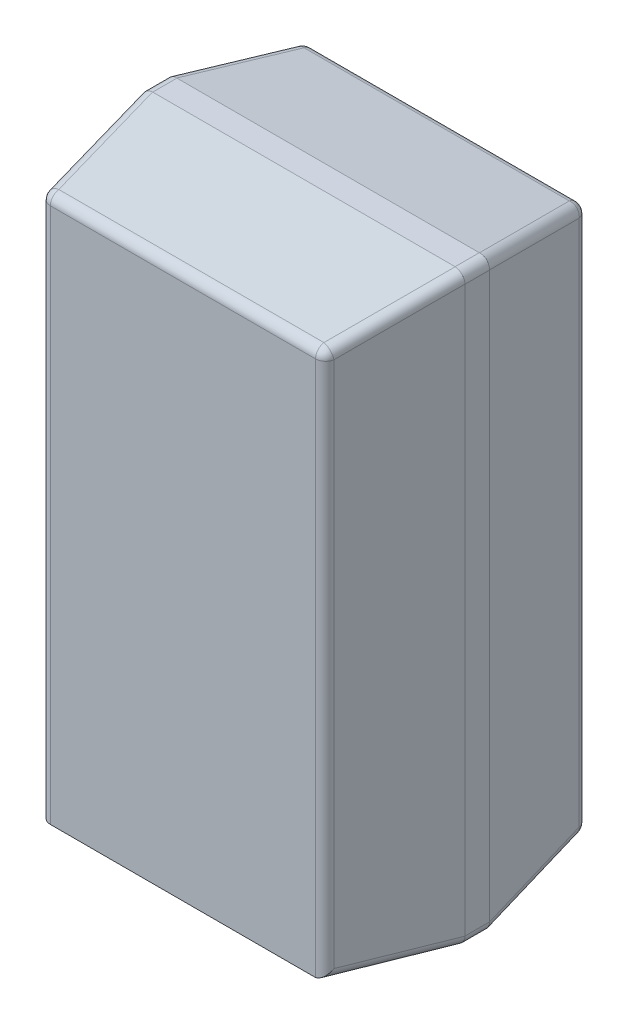
ISO-10303-21;
HEADER;
FILE_DESCRIPTION(('STEP AP214'),'2;1');
FILE_NAME('part.step','',(''),(''),'','','');
FILE_SCHEMA(('AUTOMOTIVE_DESIGN { 1 0 10303 214 1 1 1 1 }'));
ENDSEC;
DATA;
#1=APPLICATION_CONTEXT('core data for automotive mechanical design processes');
#2=APPLICATION_PROTOCOL_DEFINITION('international standard','automotive_design',2000,#1);
#3=PRODUCT_CONTEXT('',#1,'mechanical');
#4=PRODUCT('Part','Part','',(#3));
#5=PRODUCT_RELATED_PRODUCT_CATEGORY('part','',(#4));
#6=PRODUCT_DEFINITION_FORMATION('','',#4);
#7=PRODUCT_DEFINITION_CONTEXT('part definition',#1,'design');
#8=PRODUCT_DEFINITION('design','',#6,#7);
#9=PRODUCT_DEFINITION_SHAPE('','',#8);
#10=(LENGTH_UNIT() NAMED_UNIT(*) SI_UNIT(.MILLI.,.METRE.));
#11=(NAMED_UNIT(*) PLANE_ANGLE_UNIT() SI_UNIT($,.RADIAN.));
#12=(NAMED_UNIT(*) SI_UNIT($,.STERADIAN.) SOLID_ANGLE_UNIT());
#13=UNCERTAINTY_MEASURE_WITH_UNIT(LENGTH_MEASURE(1.E-05),#10,'distance_accuracy_value','');
#14=(GEOMETRIC_REPRESENTATION_CONTEXT(3) GLOBAL_UNCERTAINTY_ASSIGNED_CONTEXT((#13)) GLOBAL_UNIT_ASSIGNED_CONTEXT((#10,
#11,#12)) REPRESENTATION_CONTEXT('',''));
#15=CARTESIAN_POINT('',(0.,0.,0.));
#16=DIRECTION('',(0.,0.,1.));
#17=DIRECTION('',(1.,0.,0.));
#18=AXIS2_PLACEMENT_3D('',#15,#16,#17);
#19=CARTESIAN_POINT('',(0.,0.,1.3));
#20=DIRECTION('',(0.,0.,1.));
#21=DIRECTION('',(1.,0.,0.));
#22=AXIS2_PLACEMENT_3D('',#19,#20,#21);
#23=PLANE('',#22);
#24=DIRECTION('',(0.,1.,0.));
#25=VECTOR('',#24,1.);
#26=CARTESIAN_POINT('',(-0.657643645581,0.3625,1.3));
#27=LINE('',#26,#25);
#28=CARTESIAN_POINT('',(-0.657643645581,-1.35,1.3));
#29=VERTEX_POINT('',#28);
#30=CARTESIAN_POINT('',(-0.657643645581,1.307643645581,1.3));
#31=VERTEX_POINT('',#30);
#32=EDGE_CURVE('E438',#29,#31,#27,.T.);
#33=ORIENTED_EDGE('',*,*,#32,.F.);
#34=DIRECTION('',(-1.,0.,0.));
#35=VECTOR('',#34,1.);
#36=CARTESIAN_POINT('',(-0.4,-1.35,1.3));
#37=LINE('',#36,#35);
#38=CARTESIAN_POINT('',(0.650680303808,-1.35,1.3));
#39=VERTEX_POINT('',#38);
#40=EDGE_CURVE('E412',#39,#29,#37,.T.);
#41=ORIENTED_EDGE('',*,*,#40,.F.);
#42=CARTESIAN_POINT('',(0.649310312248,-1.299310312248,1.3));
#43=DIRECTION('',(0.,0.,-1.));
#44=DIRECTION('',(0.707106781186548,-0.707106781186548,0.));
#45=AXIS2_PLACEMENT_3D('',#42,#43,#44);
#46=ELLIPSE('',#45,0.05137011669141,0.05);
#47=CARTESIAN_POINT('',(0.657643645581,-1.349517272632,1.3));
#48=VERTEX_POINT('',#47);
#49=EDGE_CURVE('E305',#48,#39,#46,.T.);
#50=ORIENTED_EDGE('',*,*,#49,.F.);
#51=DIRECTION('',(0.,-1.,0.));
#52=VECTOR('',#51,1.);
#53=CARTESIAN_POINT('',(0.657643645581,-0.3625,1.3));
#54=LINE('',#53,#52);
#55=CARTESIAN_POINT('',(0.657643645581,1.307643645581,1.3));
#56=VERTEX_POINT('',#55);
#57=EDGE_CURVE('E398',#56,#48,#54,.T.);
#58=ORIENTED_EDGE('',*,*,#57,.F.);
#59=DIRECTION('',(1.,0.,0.));
#60=VECTOR('',#59,1.);
#61=CARTESIAN_POINT('',(0.2,1.307643645581,1.3));
#62=LINE('',#61,#60);
#63=EDGE_CURVE('E391',#31,#56,#62,.T.);
#64=ORIENTED_EDGE('',*,*,#63,.F.);
#65=EDGE_LOOP('',(#33,#41,#50,#58,#64));
#66=FACE_BOUND('',#65,.T.);
#67=ADVANCED_FACE('F17',(#66),#23,.T.);
#68=CARTESIAN_POINT('',(0.75,-0.725,1.));
#69=DIRECTION('',(0.986393923832198,0.,0.164398987305033));
#70=DIRECTION('',(0.,-1.,0.));
#71=AXIS2_PLACEMENT_3D('',#68,#69,#70);
#72=PLANE('',#71);
#73=CARTESIAN_POINT('',(0.75,-1.4,1.));
#74=DIRECTION('',(-0.986393923832198,0.,-0.164398987305033));
#75=DIRECTION('',(0.164398987305033,0.,-0.986393923832198));
#76=AXIS2_PLACEMENT_3D('',#73,#74,#75);
#77=ELLIPSE('',#76,0.304138126515,0.05);
#78=CARTESIAN_POINT('',(0.8,-1.4,0.7));
#79=VERTEX_POINT('',#78);
#80=CARTESIAN_POINT('',(0.799995433581,-1.40067573739,0.700027398512));
#81=VERTEX_POINT('',#80);
#82=EDGE_CURVE('E543',#79,#81,#77,.T.);
#83=ORIENTED_EDGE('',*,*,#82,.F.);
#84=DIRECTION('',(0.,1.,0.));
#85=VECTOR('',#84,1.);
#86=CARTESIAN_POINT('',(0.8,-0.725,0.7));
#87=LINE('',#86,#85);
#88=CARTESIAN_POINT('',(0.8,1.4,0.7));
#89=VERTEX_POINT('',#88);
#90=EDGE_CURVE('E424',#79,#89,#87,.T.);
#91=ORIENTED_EDGE('',*,*,#90,.T.);
#92=CARTESIAN_POINT('',(0.75,1.4,1.));
#93=DIRECTION('',(-0.986393923832198,0.,-0.164398987305033));
#94=DIRECTION('',(0.164398987305033,0.,-0.986393923832198));
#95=AXIS2_PLACEMENT_3D('',#92,#93,#94);
#96=ELLIPSE('',#95,0.304138126515,0.05);
#97=CARTESIAN_POINT('',(0.799995433581,1.40067573739,0.700027398512));
#98=VERTEX_POINT('',#97);
#99=EDGE_CURVE('E375',#98,#89,#96,.T.);
#100=ORIENTED_EDGE('',*,*,#99,.F.);
#101=DIRECTION('',(0.162221421130921,0.162221421130921,-0.973328526784523));
#102=VECTOR('',#101,1.);
#103=CARTESIAN_POINT('',(0.718732097268,1.319412401077,1.187607416391));
#104=LINE('',#103,#102);
#105=CARTESIAN_POINT('',(0.706963341772,1.307643645581,1.258219949365));
#106=VERTEX_POINT('',#105);
#107=EDGE_CURVE('E344',#106,#98,#104,.T.);
#108=ORIENTED_EDGE('',*,*,#107,.F.);
#109=DIRECTION('',(0.,1.,0.));
#110=VECTOR('',#109,1.);
#111=CARTESIAN_POINT('',(0.706963341772,-0.3625,1.258219949365));
#112=LINE('',#111,#110);
#113=CARTESIAN_POINT('',(0.706963341772,-1.307643645581,1.258219949365));
#114=VERTEX_POINT('',#113);
#115=EDGE_CURVE('E395',#114,#106,#112,.T.);
#116=ORIENTED_EDGE('',*,*,#115,.F.);
#117=DIRECTION('',(-0.162221421130921,0.162221421130921,0.973328526784523));
#118=VECTOR('',#117,1.);
#119=CARTESIAN_POINT('',(0.727284728847,-1.327965032656,1.136291626917));
#120=LINE('',#119,#118);
#121=EDGE_CURVE('E470',#81,#114,#120,.T.);
#122=ORIENTED_EDGE('',*,*,#121,.F.);
#123=EDGE_LOOP('',(#83,#91,#100,#108,#116,#122));
#124=FACE_BOUND('',#123,.T.);
#125=ADVANCED_FACE('F618',(#124),#72,.T.);
#126=CARTESIAN_POINT('',(0.8,1.45,0.));
#127=DIRECTION('',(0.,1.,0.));
#128=DIRECTION('',(1.,0.,0.));
#129=AXIS2_PLACEMENT_3D('',#126,#127,#128);
#130=PLANE('',#129);
#131=DIRECTION('',(0.,0.,-1.));
#132=VECTOR('',#131,1.);
#133=CARTESIAN_POINT('',(-0.75,1.45,0.));
#134=LINE('',#133,#132);
#135=CARTESIAN_POINT('',(-0.75,1.45,0.7));
#136=VERTEX_POINT('',#135);
#137=CARTESIAN_POINT('',(-0.75,1.45,0.58));
#138=VERTEX_POINT('',#137);
#139=EDGE_CURVE('E482',#136,#138,#134,.T.);
#140=ORIENTED_EDGE('',*,*,#139,.F.);
#141=DIRECTION('',(-1.,0.,0.));
#142=VECTOR('',#141,1.);
#143=CARTESIAN_POINT('',(0.4,1.45,0.7));
#144=LINE('',#143,#142);
#145=CARTESIAN_POINT('',(0.75,1.45,0.7));
#146=VERTEX_POINT('',#145);
#147=EDGE_CURVE('E20',#146,#136,#144,.T.);
#148=ORIENTED_EDGE('',*,*,#147,.F.);
#149=DIRECTION('',(0.,0.,1.));
#150=VECTOR('',#149,1.);
#151=CARTESIAN_POINT('',(0.75,1.45,0.));
#152=LINE('',#151,#150);
#153=CARTESIAN_POINT('',(0.75,1.45,0.58));
#154=VERTEX_POINT('',#153);
#155=EDGE_CURVE('E365',#154,#146,#152,.T.);
#156=ORIENTED_EDGE('',*,*,#155,.F.);
#157=DIRECTION('',(1.,0.,0.));
#158=VECTOR('',#157,1.);
#159=CARTESIAN_POINT('',(0.4,1.45,0.58));
#160=LINE('',#159,#158);
#161=EDGE_CURVE('E11',#138,#154,#160,.T.);
#162=ORIENTED_EDGE('',*,*,#161,.F.);
#163=EDGE_LOOP('',(#140,#148,#156,#162));
#164=FACE_BOUND('',#163,.T.);
#165=ADVANCED_FACE('F622',(#164),#130,.T.);
#166=CARTESIAN_POINT('',(0.4,1.4,0.29));
#167=DIRECTION('',(0.,0.985460115744279,-0.169906916508048));
#168=DIRECTION('',(-1.,0.,0.));
#169=AXIS2_PLACEMENT_3D('',#166,#167,#168);
#170=PLANE('',#169);
#171=CARTESIAN_POINT('',(-0.75,1.4,0.29));
#172=DIRECTION('',(0.,-0.985460115744279,0.169906916508048));
#173=DIRECTION('',(0.,0.169906916508048,0.985460115744279));
#174=AXIS2_PLACEMENT_3D('',#171,#172,#173);
#175=ELLIPSE('',#174,0.294278779391,0.05);
#176=CARTESIAN_POINT('',(-0.750721784217,1.449994790004,0.579969782023));
#177=VERTEX_POINT('',#176);
#178=EDGE_CURVE('E477',#138,#177,#175,.T.);
#179=ORIENTED_EDGE('',*,*,#178,.F.);
#180=ORIENTED_EDGE('',*,*,#161,.T.);
#181=CARTESIAN_POINT('',(0.75,1.4,0.29));
#182=DIRECTION('',(0.,-0.985460115744279,0.169906916508048));
#183=DIRECTION('',(0.,0.169906916508048,0.985460115744279));
#184=AXIS2_PLACEMENT_3D('',#181,#182,#183);
#185=ELLIPSE('',#184,0.294278779391,0.05);
#186=CARTESIAN_POINT('',(0.750721784217,1.449994790004,0.579969782023));
#187=VERTEX_POINT('',#186);
#188=EDGE_CURVE('E366',#187,#154,#185,.T.);
#189=ORIENTED_EDGE('',*,*,#188,.F.);
#190=DIRECTION('',(0.167506302542942,0.167506302542942,0.971536554750661));
#191=VECTOR('',#190,1.);
#192=CARTESIAN_POINT('',(0.667387291794,1.366660297581,0.09662972596986));
#193=LINE('',#192,#191);
#194=CARTESIAN_POINT('',(0.65788296907,1.357155974858,0.04150465417462));
#195=VERTEX_POINT('',#194);
#196=EDGE_CURVE('E38',#195,#187,#193,.T.);
#197=ORIENTED_EDGE('',*,*,#196,.F.);
#198=DIRECTION('',(1.,0.,0.));
#199=VECTOR('',#198,1.);
#200=CARTESIAN_POINT('',(0.2,1.357155974858,0.04150465417462));
#201=LINE('',#200,#199);
#202=CARTESIAN_POINT('',(-0.65788296907,1.357155974858,0.04150465417462));
#203=VERTEX_POINT('',#202);
#204=EDGE_CURVE('E353',#203,#195,#201,.T.);
#205=ORIENTED_EDGE('',*,*,#204,.F.);
#206=DIRECTION('',(0.167506302542942,-0.167506302542942,-0.971536554750661));
#207=VECTOR('',#206,1.);
#208=CARTESIAN_POINT('',(-0.676506259246,1.375779265033,0.149519737193));
#209=LINE('',#208,#207);
#210=EDGE_CURVE('E331',#177,#203,#209,.T.);
#211=ORIENTED_EDGE('',*,*,#210,.F.);
#212=EDGE_LOOP('',(#179,#180,#189,#197,#205,#211));
#213=FACE_BOUND('',#212,.T.);
#214=ADVANCED_FACE('F626',(#213),#170,.T.);
#215=CARTESIAN_POINT('',(-0.75,0.725,0.29));
#216=DIRECTION('',(-0.985460115744279,0.,-0.169906916508048));
#217=DIRECTION('',(-0.169906916508048,0.,0.985460115744279));
#218=AXIS2_PLACEMENT_3D('',#215,#216,#217);
#219=PLANE('',#218);
#220=CARTESIAN_POINT('',(-0.75,-1.4,0.29));
#221=DIRECTION('',(0.985460115744279,0.,0.169906916508048));
#222=DIRECTION('',(-0.169906916508048,0.,0.985460115744279));
#223=AXIS2_PLACEMENT_3D('',#220,#221,#222);
#224=ELLIPSE('',#223,0.294278779391,0.05);
#225=CARTESIAN_POINT('',(-0.8,-1.4,0.58));
#226=VERTEX_POINT('',#225);
#227=CARTESIAN_POINT('',(-0.799994790004,-1.400721784217,0.579969782023));
#228=VERTEX_POINT('',#227);
#229=EDGE_CURVE('E1134',#226,#228,#224,.T.);
#230=ORIENTED_EDGE('',*,*,#229,.F.);
#231=DIRECTION('',(0.,1.,0.));
#232=VECTOR('',#231,1.);
#233=CARTESIAN_POINT('',(-0.8,0.725,0.58));
#234=LINE('',#233,#232);
#235=CARTESIAN_POINT('',(-0.8,1.4,0.58));
#236=VERTEX_POINT('',#235);
#237=EDGE_CURVE('E408',#226,#236,#234,.T.);
#238=ORIENTED_EDGE('',*,*,#237,.T.);
#239=CARTESIAN_POINT('',(-0.75,1.4,0.29));
#240=DIRECTION('',(0.985460115744279,0.,0.169906916508048));
#241=DIRECTION('',(-0.169906916508048,0.,0.985460115744279));
#242=AXIS2_PLACEMENT_3D('',#239,#240,#241);
#243=ELLIPSE('',#242,0.294278779391,0.05);
#244=CARTESIAN_POINT('',(-0.799994790004,1.400721784217,0.579969782023));
#245=VERTEX_POINT('',#244);
#246=EDGE_CURVE('E489',#245,#236,#243,.T.);
#247=ORIENTED_EDGE('',*,*,#246,.F.);
#248=DIRECTION('',(-0.167506302542942,0.167506302542942,0.971536554750661));
#249=VECTOR('',#248,1.);
#250=CARTESIAN_POINT('',(-0.725779265033,1.326506259246,0.149519737193));
#251=LINE('',#250,#249);
#252=CARTESIAN_POINT('',(-0.707155974858,1.30788296907,0.04150465417462));
#253=VERTEX_POINT('',#252);
#254=EDGE_CURVE('E332',#253,#245,#251,.T.);
#255=ORIENTED_EDGE('',*,*,#254,.F.);
#256=DIRECTION('',(0.,1.,0.));
#257=VECTOR('',#256,1.);
#258=CARTESIAN_POINT('',(-0.707155974858,0.3625,0.04150465417462));
#259=LINE('',#258,#257);
#260=CARTESIAN_POINT('',(-0.707155974858,-1.30788296907,0.04150465417462));
#261=VERTEX_POINT('',#260);
#262=EDGE_CURVE('E401',#261,#253,#259,.T.);
#263=ORIENTED_EDGE('',*,*,#262,.F.);
#264=DIRECTION('',(0.167506302542942,0.167506302542942,-0.971536554750661));
#265=VECTOR('',#264,1.);
#266=CARTESIAN_POINT('',(-0.716660297581,-1.317387291794,0.09662972596986));
#267=LINE('',#266,#265);
#268=EDGE_CURVE('E436',#228,#261,#267,.T.);
#269=ORIENTED_EDGE('',*,*,#268,.F.);
#270=EDGE_LOOP('',(#230,#238,#247,#255,#263,#269));
#271=FACE_BOUND('',#270,.T.);
#272=ADVANCED_FACE('F632',(#271),#219,.T.);
#273=CARTESIAN_POINT('',(0.,0.,0.));
#274=DIRECTION('',(0.,0.,1.));
#275=DIRECTION('',(1.,0.,0.));
#276=AXIS2_PLACEMENT_3D('',#273,#274,#275);
#277=PLANE('',#276);
#278=DIRECTION('',(-1.,0.,0.));
#279=VECTOR('',#278,1.);
#280=CARTESIAN_POINT('',(0.2,1.30788296907,0.));
#281=LINE('',#280,#279);
#282=CARTESIAN_POINT('',(0.65788296907,1.30788296907,0.));
#283=VERTEX_POINT('',#282);
#284=CARTESIAN_POINT('',(-0.65788296907,1.30788296907,0.));
#285=VERTEX_POINT('',#284);
#286=EDGE_CURVE('E263',#283,#285,#281,.T.);
#287=ORIENTED_EDGE('',*,*,#286,.F.);
#288=DIRECTION('',(0.,1.,0.));
#289=VECTOR('',#288,1.);
#290=CARTESIAN_POINT('',(0.65788296907,-0.3625,0.));
#291=LINE('',#290,#289);
#292=CARTESIAN_POINT('',(0.65788296907,-1.30788296907,0.));
#293=VERTEX_POINT('',#292);
#294=EDGE_CURVE('E257',#293,#283,#291,.T.);
#295=ORIENTED_EDGE('',*,*,#294,.F.);
#296=DIRECTION('',(1.,0.,0.));
#297=VECTOR('',#296,1.);
#298=CARTESIAN_POINT('',(-0.2,-1.30788296907,0.));
#299=LINE('',#298,#297);
#300=CARTESIAN_POINT('',(-0.65788296907,-1.30788296907,0.));
#301=VERTEX_POINT('',#300);
#302=EDGE_CURVE('E260',#301,#293,#299,.T.);
#303=ORIENTED_EDGE('',*,*,#302,.F.);
#304=DIRECTION('',(0.,-1.,0.));
#305=VECTOR('',#304,1.);
#306=CARTESIAN_POINT('',(-0.65788296907,0.3625,0.));
#307=LINE('',#306,#305);
#308=EDGE_CURVE('E404',#285,#301,#307,.T.);
#309=ORIENTED_EDGE('',*,*,#308,.F.);
#310=EDGE_LOOP('',(#287,#295,#303,#309));
#311=FACE_BOUND('',#310,.T.);
#312=ADVANCED_FACE('F259',(#311),#277,.F.);
#313=CARTESIAN_POINT('',(0.4,1.4,1.));
#314=DIRECTION('',(0.,0.986393923832198,0.164398987305033));
#315=DIRECTION('',(1.,0.,0.));
#316=AXIS2_PLACEMENT_3D('',#313,#314,#315);
#317=PLANE('',#316);
#318=CARTESIAN_POINT('',(-0.75,1.4,1.));
#319=DIRECTION('',(0.,-0.986393923832198,-0.164398987305033));
#320=DIRECTION('',(0.,0.164398987305033,-0.986393923832198));
#321=AXIS2_PLACEMENT_3D('',#318,#319,#320);
#322=ELLIPSE('',#321,0.304138126515,0.05);
#323=CARTESIAN_POINT('',(-0.75067573739,1.449995433581,0.700027398512));
#324=VERTEX_POINT('',#323);
#325=EDGE_CURVE('E474',#324,#136,#322,.T.);
#326=ORIENTED_EDGE('',*,*,#325,.F.);
#327=DIRECTION('',(-0.162221421130921,0.162221421130921,-0.973328526784523));
#328=VECTOR('',#327,1.);
#329=CARTESIAN_POINT('',(-0.677965032656,1.377284728847,1.136291626917));
#330=LINE('',#329,#328);
#331=CARTESIAN_POINT('',(-0.657643645581,1.356963341772,1.258219949365));
#332=VERTEX_POINT('',#331);
#333=EDGE_CURVE('E448',#332,#324,#330,.T.);
#334=ORIENTED_EDGE('',*,*,#333,.F.);
#335=DIRECTION('',(-1.,0.,0.));
#336=VECTOR('',#335,1.);
#337=CARTESIAN_POINT('',(0.2,1.356963341772,1.258219949365));
#338=LINE('',#337,#336);
#339=CARTESIAN_POINT('',(0.657643645581,1.356963341772,1.258219949365));
#340=VERTEX_POINT('',#339);
#341=EDGE_CURVE('E269',#340,#332,#338,.T.);
#342=ORIENTED_EDGE('',*,*,#341,.F.);
#343=DIRECTION('',(-0.162221421130921,-0.162221421130921,0.973328526784523));
#344=VECTOR('',#343,1.);
#345=CARTESIAN_POINT('',(0.669412401077,1.368732097268,1.187607416391));
#346=LINE('',#345,#344);
#347=CARTESIAN_POINT('',(0.75067573739,1.449995433581,0.700027398512));
#348=VERTEX_POINT('',#347);
#349=EDGE_CURVE('E349',#348,#340,#346,.T.);
#350=ORIENTED_EDGE('',*,*,#349,.F.);
#351=CARTESIAN_POINT('',(0.75,1.4,1.));
#352=DIRECTION('',(0.,-0.986393923832198,-0.164398987305033));
#353=DIRECTION('',(0.,0.164398987305033,-0.986393923832198));
#354=AXIS2_PLACEMENT_3D('',#351,#352,#353);
#355=ELLIPSE('',#354,0.304138126515,0.05);
#356=EDGE_CURVE('E374',#146,#348,#355,.T.);
#357=ORIENTED_EDGE('',*,*,#356,.F.);
#358=ORIENTED_EDGE('',*,*,#147,.T.);
#359=EDGE_LOOP('',(#326,#334,#342,#350,#357,#358));
#360=FACE_BOUND('',#359,.T.);
#361=ADVANCED_FACE('F638',(#360),#317,.T.);
#362=CARTESIAN_POINT('',(0.8,-1.45,0.));
#363=DIRECTION('',(1.,0.,0.));
#364=DIRECTION('',(0.,1.,0.));
#365=AXIS2_PLACEMENT_3D('',#362,#363,#364);
#366=PLANE('',#365);
#367=DIRECTION('',(0.,0.,1.));
#368=VECTOR('',#367,1.);
#369=CARTESIAN_POINT('',(0.8,-1.4,0.));
#370=LINE('',#369,#368);
#371=CARTESIAN_POINT('',(0.8,-1.4,0.58));
#372=VERTEX_POINT('',#371);
#373=EDGE_CURVE('E550',#372,#79,#370,.T.);
#374=ORIENTED_EDGE('',*,*,#373,.F.);
#375=DIRECTION('',(0.,-1.,0.));
#376=VECTOR('',#375,1.);
#377=CARTESIAN_POINT('',(0.8,-0.725,0.58));
#378=LINE('',#377,#376);
#379=CARTESIAN_POINT('',(0.8,1.4,0.58));
#380=VERTEX_POINT('',#379);
#381=EDGE_CURVE('E414',#380,#372,#378,.T.);
#382=ORIENTED_EDGE('',*,*,#381,.F.);
#383=DIRECTION('',(0.,0.,-1.));
#384=VECTOR('',#383,1.);
#385=CARTESIAN_POINT('',(0.8,1.4,0.));
#386=LINE('',#385,#384);
#387=EDGE_CURVE('E379',#89,#380,#386,.T.);
#388=ORIENTED_EDGE('',*,*,#387,.F.);
#389=ORIENTED_EDGE('',*,*,#90,.F.);
#390=EDGE_LOOP('',(#374,#382,#388,#389));
#391=FACE_BOUND('',#390,.T.);
#392=ADVANCED_FACE('F641',(#391),#366,.T.);
#393=CARTESIAN_POINT('',(0.75,-0.725,0.29));
#394=DIRECTION('',(0.985460115744279,0.,-0.169906916508048));
#395=DIRECTION('',(0.,-1.,0.));
#396=AXIS2_PLACEMENT_3D('',#393,#394,#395);
#397=PLANE('',#396);
#398=CARTESIAN_POINT('',(0.75,-1.4,0.29));
#399=DIRECTION('',(-0.985460115744279,0.,0.169906916508048));
#400=DIRECTION('',(0.169906916508048,0.,0.985460115744279));
#401=AXIS2_PLACEMENT_3D('',#398,#399,#400);
#402=ELLIPSE('',#401,0.294278779391,0.05);
#403=CARTESIAN_POINT('',(0.799994790004,-1.400721784217,0.579969782023));
#404=VERTEX_POINT('',#403);
#405=EDGE_CURVE('E572',#404,#372,#402,.T.);
#406=ORIENTED_EDGE('',*,*,#405,.F.);
#407=DIRECTION('',(0.167506302542942,-0.167506302542942,0.971536554750661));
#408=VECTOR('',#407,1.);
#409=CARTESIAN_POINT('',(0.725779265033,-1.326506259246,0.149519737193));
#410=LINE('',#409,#408);
#411=CARTESIAN_POINT('',(0.707155974858,-1.30788296907,0.04150465417462));
#412=VERTEX_POINT('',#411);
#413=EDGE_CURVE('E312',#412,#404,#410,.T.);
#414=ORIENTED_EDGE('',*,*,#413,.F.);
#415=DIRECTION('',(0.,-1.,0.));
#416=VECTOR('',#415,1.);
#417=CARTESIAN_POINT('',(0.707155974858,-0.3625,0.04150465417462));
#418=LINE('',#417,#416);
#419=CARTESIAN_POINT('',(0.707155974858,1.30788296907,0.04150465417462));
#420=VERTEX_POINT('',#419);
#421=EDGE_CURVE('E270',#420,#412,#418,.T.);
#422=ORIENTED_EDGE('',*,*,#421,.F.);
#423=DIRECTION('',(-0.167506302542942,-0.167506302542942,-0.971536554750661));
#424=VECTOR('',#423,1.);
#425=CARTESIAN_POINT('',(0.716660297581,1.317387291794,0.09662972596986));
#426=LINE('',#425,#424);
#427=CARTESIAN_POINT('',(0.799994790004,1.400721784217,0.579969782023));
#428=VERTEX_POINT('',#427);
#429=EDGE_CURVE('E48',#428,#420,#426,.T.);
#430=ORIENTED_EDGE('',*,*,#429,.F.);
#431=CARTESIAN_POINT('',(0.75,1.4,0.29));
#432=DIRECTION('',(-0.985460115744279,0.,0.169906916508048));
#433=DIRECTION('',(0.169906916508048,0.,0.985460115744279));
#434=AXIS2_PLACEMENT_3D('',#431,#432,#433);
#435=ELLIPSE('',#434,0.294278779391,0.05);
#436=EDGE_CURVE('E380',#380,#428,#435,.T.);
#437=ORIENTED_EDGE('',*,*,#436,.F.);
#438=ORIENTED_EDGE('',*,*,#381,.T.);
#439=EDGE_LOOP('',(#406,#414,#422,#430,#437,#438));
#440=FACE_BOUND('',#439,.T.);
#441=ADVANCED_FACE('F645',(#440),#397,.T.);
#442=CARTESIAN_POINT('',(-0.4,-1.4,1.));
#443=DIRECTION('',(0.,-0.986393923832198,0.164398987305033));
#444=DIRECTION('',(-1.,0.,0.));
#445=AXIS2_PLACEMENT_3D('',#442,#443,#444);
#446=PLANE('',#445);
#447=CARTESIAN_POINT('',(-0.75,-1.4,1.));
#448=DIRECTION('',(0.,0.986393923832198,-0.164398987305033));
#449=DIRECTION('',(0.,-0.164398987305033,-0.986393923832198));
#450=AXIS2_PLACEMENT_3D('',#447,#448,#449);
#451=ELLIPSE('',#450,0.304138126515,0.05);
#452=CARTESIAN_POINT('',(-0.75,-1.45,0.7));
#453=VERTEX_POINT('',#452);
#454=CARTESIAN_POINT('',(-0.785355339059,-1.435355339059,0.787867965644));
#455=VERTEX_POINT('',#454);
#456=EDGE_CURVE('E557',#453,#455,#451,.T.);
#457=ORIENTED_EDGE('',*,*,#456,.F.);
#458=DIRECTION('',(1.,0.,0.));
#459=VECTOR('',#458,1.);
#460=CARTESIAN_POINT('',(-0.4,-1.45,0.7));
#461=LINE('',#460,#459);
#462=CARTESIAN_POINT('',(0.75,-1.45,0.7));
#463=VERTEX_POINT('',#462);
#464=EDGE_CURVE('E415',#453,#463,#461,.T.);
#465=ORIENTED_EDGE('',*,*,#464,.T.);
#466=CARTESIAN_POINT('',(0.75,-1.4,1.));
#467=DIRECTION('',(0.,0.986393923832198,-0.164398987305033));
#468=DIRECTION('',(0.,-0.164398987305033,-0.986393923832198));
#469=AXIS2_PLACEMENT_3D('',#466,#467,#468);
#470=ELLIPSE('',#469,0.304138126515,0.05);
#471=CARTESIAN_POINT('',(0.75067573739,-1.449995433581,0.700027398512));
#472=VERTEX_POINT('',#471);
#473=EDGE_CURVE('E537',#472,#463,#470,.T.);
#474=ORIENTED_EDGE('',*,*,#473,.F.);
#475=DIRECTION('',(0.162221421130921,-0.162221421130921,-0.973328526784523));
#476=VECTOR('',#475,1.);
#477=CARTESIAN_POINT('',(0.677965032656,-1.377284728847,1.136291626917));
#478=LINE('',#477,#476);
#479=EDGE_CURVE('E297',#39,#472,#478,.T.);
#480=ORIENTED_EDGE('',*,*,#479,.F.);
#481=ORIENTED_EDGE('',*,*,#40,.T.);
#482=CARTESIAN_POINT('',(-0.657643645581,-1.358333333333,1.25));
#483=DIRECTION('',(0.,0.986393923832198,-0.164398987305033));
#484=DIRECTION('',(0.,0.164398987305033,0.986393923832198));
#485=AXIS2_PLACEMENT_3D('',#482,#483,#484);
#486=ELLIPSE('',#485,0.05068968775249,0.05);
#487=CARTESIAN_POINT('',(-0.706963341772,-1.356963341772,1.258219949365));
#488=VERTEX_POINT('',#487);
#489=EDGE_CURVE('E443',#488,#29,#486,.T.);
#490=ORIENTED_EDGE('',*,*,#489,.F.);
#491=DIRECTION('',(0.162221421130921,0.162221421130921,0.973328526784523));
#492=VECTOR('',#491,1.);
#493=CARTESIAN_POINT('',(-0.717434210526,-1.367434210526,1.195394736842));
#494=LINE('',#493,#492);
#495=EDGE_CURVE('E410',#455,#488,#494,.T.);
#496=ORIENTED_EDGE('',*,*,#495,.F.);
#497=EDGE_LOOP('',(#457,#465,#474,#480,#481,#490,#496));
#498=FACE_BOUND('',#497,.T.);
#499=ADVANCED_FACE('F535',(#498),#446,.T.);
#500=CARTESIAN_POINT('',(-0.8,-1.45,0.));
#501=DIRECTION('',(0.,-1.,0.));
#502=DIRECTION('',(0.,0.,-1.));
#503=AXIS2_PLACEMENT_3D('',#500,#501,#502);
#504=PLANE('',#503);
#505=DIRECTION('',(0.,0.,1.));
#506=VECTOR('',#505,1.);
#507=CARTESIAN_POINT('',(-0.75,-1.45,0.));
#508=LINE('',#507,#506);
#509=CARTESIAN_POINT('',(-0.75,-1.45,0.58));
#510=VERTEX_POINT('',#509);
#511=EDGE_CURVE('E1101',#510,#453,#508,.T.);
#512=ORIENTED_EDGE('',*,*,#511,.F.);
#513=DIRECTION('',(-1.,0.,0.));
#514=VECTOR('',#513,1.);
#515=CARTESIAN_POINT('',(-0.4,-1.45,0.58));
#516=LINE('',#515,#514);
#517=CARTESIAN_POINT('',(0.75,-1.45,0.58));
#518=VERTEX_POINT('',#517);
#519=EDGE_CURVE('E407',#518,#510,#516,.T.);
#520=ORIENTED_EDGE('',*,*,#519,.F.);
#521=DIRECTION('',(0.,0.,-1.));
#522=VECTOR('',#521,1.);
#523=CARTESIAN_POINT('',(0.75,-1.45,0.));
#524=LINE('',#523,#522);
#525=EDGE_CURVE('E566',#463,#518,#524,.T.);
#526=ORIENTED_EDGE('',*,*,#525,.F.);
#527=ORIENTED_EDGE('',*,*,#464,.F.);
#528=EDGE_LOOP('',(#512,#520,#526,#527));
#529=FACE_BOUND('',#528,.T.);
#530=ADVANCED_FACE('F649',(#529),#504,.T.);
#531=CARTESIAN_POINT('',(-0.75,0.725,1.));
#532=DIRECTION('',(-0.986393923832198,0.,0.164398987305033));
#533=DIRECTION('',(0.,1.,0.));
#534=AXIS2_PLACEMENT_3D('',#531,#532,#533);
#535=PLANE('',#534);
#536=CARTESIAN_POINT('',(-0.75,-1.4,1.));
#537=DIRECTION('',(0.986393923832198,0.,-0.164398987305033));
#538=DIRECTION('',(-0.164398987305033,0.,-0.986393923832198));
#539=AXIS2_PLACEMENT_3D('',#536,#537,#538);
#540=ELLIPSE('',#539,0.304138126515,0.05);
#541=CARTESIAN_POINT('',(-0.8,-1.4,0.7));
#542=VERTEX_POINT('',#541);
#543=EDGE_CURVE('E1135',#455,#542,#540,.T.);
#544=ORIENTED_EDGE('',*,*,#543,.F.);
#545=ORIENTED_EDGE('',*,*,#495,.T.);
#546=DIRECTION('',(0.,-1.,0.));
#547=VECTOR('',#546,1.);
#548=CARTESIAN_POINT('',(-0.706963341772,0.3625,1.258219949365));
#549=LINE('',#548,#547);
#550=CARTESIAN_POINT('',(-0.706963341772,1.307643645581,1.258219949365));
#551=VERTEX_POINT('',#550);
#552=EDGE_CURVE('E442',#551,#488,#549,.T.);
#553=ORIENTED_EDGE('',*,*,#552,.F.);
#554=DIRECTION('',(0.162221421130921,-0.162221421130921,0.973328526784523));
#555=VECTOR('',#554,1.);
#556=CARTESIAN_POINT('',(-0.727284728847,1.327965032656,1.136291626917));
#557=LINE('',#556,#555);
#558=CARTESIAN_POINT('',(-0.799995433581,1.40067573739,0.700027398512));
#559=VERTEX_POINT('',#558);
#560=EDGE_CURVE('E444',#559,#551,#557,.T.);
#561=ORIENTED_EDGE('',*,*,#560,.F.);
#562=CARTESIAN_POINT('',(-0.75,1.4,1.));
#563=DIRECTION('',(0.986393923832198,0.,-0.164398987305033));
#564=DIRECTION('',(-0.164398987305033,0.,-0.986393923832198));
#565=AXIS2_PLACEMENT_3D('',#562,#563,#564);
#566=ELLIPSE('',#565,0.304138126515,0.05);
#567=CARTESIAN_POINT('',(-0.8,1.4,0.7));
#568=VERTEX_POINT('',#567);
#569=EDGE_CURVE('E454',#568,#559,#566,.T.);
#570=ORIENTED_EDGE('',*,*,#569,.F.);
#571=DIRECTION('',(0.,-1.,0.));
#572=VECTOR('',#571,1.);
#573=CARTESIAN_POINT('',(-0.8,0.725,0.7));
#574=LINE('',#573,#572);
#575=EDGE_CURVE('E411',#568,#542,#574,.T.);
#576=ORIENTED_EDGE('',*,*,#575,.T.);
#577=EDGE_LOOP('',(#544,#545,#553,#561,#570,#576));
#578=FACE_BOUND('',#577,.T.);
#579=ADVANCED_FACE('F650',(#578),#535,.T.);
#580=CARTESIAN_POINT('',(-0.8,1.45,0.));
#581=DIRECTION('',(-1.,0.,0.));
#582=DIRECTION('',(0.,1.,0.));
#583=AXIS2_PLACEMENT_3D('',#580,#581,#582);
#584=PLANE('',#583);
#585=DIRECTION('',(0.,0.,-1.));
#586=VECTOR('',#585,1.);
#587=CARTESIAN_POINT('',(-0.8,-1.4,0.));
#588=LINE('',#587,#586);
#589=EDGE_CURVE('E1129',#542,#226,#588,.T.);
#590=ORIENTED_EDGE('',*,*,#589,.F.);
#591=ORIENTED_EDGE('',*,*,#575,.F.);
#592=DIRECTION('',(0.,0.,1.));
#593=VECTOR('',#592,1.);
#594=CARTESIAN_POINT('',(-0.8,1.4,0.));
#595=LINE('',#594,#593);
#596=EDGE_CURVE('E450',#236,#568,#595,.T.);
#597=ORIENTED_EDGE('',*,*,#596,.F.);
#598=ORIENTED_EDGE('',*,*,#237,.F.);
#599=EDGE_LOOP('',(#590,#591,#597,#598));
#600=FACE_BOUND('',#599,.T.);
#601=ADVANCED_FACE('F653',(#600),#584,.T.);
#602=CARTESIAN_POINT('',(-0.4,-1.4,0.29));
#603=DIRECTION('',(0.,-0.985460115744279,-0.169906916508048));
#604=DIRECTION('',(0.,0.169906916508048,-0.985460115744279));
#605=AXIS2_PLACEMENT_3D('',#602,#603,#604);
#606=PLANE('',#605);
#607=CARTESIAN_POINT('',(-0.75,-1.4,0.29));
#608=DIRECTION('',(0.,0.985460115744279,0.169906916508048));
#609=DIRECTION('',(0.,-0.169906916508048,0.985460115744279));
#610=AXIS2_PLACEMENT_3D('',#607,#608,#609);
#611=ELLIPSE('',#610,0.294278779391,0.05);
#612=CARTESIAN_POINT('',(-0.750721784217,-1.449994790004,0.579969782023));
#613=VERTEX_POINT('',#612);
#614=EDGE_CURVE('E1096',#613,#510,#611,.T.);
#615=ORIENTED_EDGE('',*,*,#614,.F.);
#616=DIRECTION('',(-0.167506302542942,-0.167506302542942,0.971536554750661));
#617=VECTOR('',#616,1.);
#618=CARTESIAN_POINT('',(-0.667387291794,-1.366660297581,0.09662972596986));
#619=LINE('',#618,#617);
#620=CARTESIAN_POINT('',(-0.65788296907,-1.357155974858,0.04150465417462));
#621=VERTEX_POINT('',#620);
#622=EDGE_CURVE('E455',#621,#613,#619,.T.);
#623=ORIENTED_EDGE('',*,*,#622,.F.);
#624=DIRECTION('',(-1.,0.,0.));
#625=VECTOR('',#624,1.);
#626=CARTESIAN_POINT('',(-0.2,-1.357155974858,0.04150465417462));
#627=LINE('',#626,#625);
#628=CARTESIAN_POINT('',(0.65788296907,-1.357155974858,0.04150465417462));
#629=VERTEX_POINT('',#628);
#630=EDGE_CURVE('E283',#629,#621,#627,.T.);
#631=ORIENTED_EDGE('',*,*,#630,.F.);
#632=DIRECTION('',(-0.167506302542942,0.167506302542942,-0.971536554750661));
#633=VECTOR('',#632,1.);
#634=CARTESIAN_POINT('',(0.676506259246,-1.375779265033,0.149519737193));
#635=LINE('',#634,#633);
#636=CARTESIAN_POINT('',(0.750721784217,-1.449994790004,0.579969782023));
#637=VERTEX_POINT('',#636);
#638=EDGE_CURVE('E292',#637,#629,#635,.T.);
#639=ORIENTED_EDGE('',*,*,#638,.F.);
#640=CARTESIAN_POINT('',(0.75,-1.4,0.29));
#641=DIRECTION('',(0.,0.985460115744279,0.169906916508048));
#642=DIRECTION('',(0.,-0.169906916508048,0.985460115744279));
#643=AXIS2_PLACEMENT_3D('',#640,#641,#642);
#644=ELLIPSE('',#643,0.294278779391,0.05);
#645=EDGE_CURVE('E567',#518,#637,#644,.T.);
#646=ORIENTED_EDGE('',*,*,#645,.F.);
#647=ORIENTED_EDGE('',*,*,#519,.T.);
#648=EDGE_LOOP('',(#615,#623,#631,#639,#646,#647));
#649=FACE_BOUND('',#648,.T.);
#650=ADVANCED_FACE('F657',(#649),#606,.T.);
#651=CARTESIAN_POINT('',(-0.65788296907,0.3625,0.05));
#652=DIRECTION('',(0.,-1.,0.));
#653=DIRECTION('',(-0.644241058724346,0.,-0.764822501142411));
#654=AXIS2_PLACEMENT_3D('',#651,#652,#653);
#655=CYLINDRICAL_SURFACE('',#654,0.05);
#656=CARTESIAN_POINT('',(-0.65788296907,-1.30788296907,0.05));
#657=DIRECTION('',(0.,-1.,0.));
#658=DIRECTION('',(0.,0.,-1.));
#659=AXIS2_PLACEMENT_3D('',#656,#657,#658);
#660=CIRCLE('',#659,0.05);
#661=EDGE_CURVE('E580',#261,#301,#660,.T.);
#662=ORIENTED_EDGE('',*,*,#661,.F.);
#663=ORIENTED_EDGE('',*,*,#262,.T.);
#664=CARTESIAN_POINT('',(-0.65788296907,1.30788296907,0.05));
#665=DIRECTION('',(0.,1.,0.));
#666=DIRECTION('',(-0.985460115744279,0.,-0.169906916508048));
#667=AXIS2_PLACEMENT_3D('',#664,#665,#666);
#668=CIRCLE('',#667,0.05);
#669=EDGE_CURVE('E282',#285,#253,#668,.T.);
#670=ORIENTED_EDGE('',*,*,#669,.F.);
#671=ORIENTED_EDGE('',*,*,#308,.T.);
#672=EDGE_LOOP('',(#662,#663,#670,#671));
#673=FACE_BOUND('',#672,.T.);
#674=ADVANCED_FACE('F600',(#673),#655,.T.);
#675=CARTESIAN_POINT('',(0.657643645581,-0.3625,1.25));
#676=DIRECTION('',(0.,-1.,0.));
#677=DIRECTION('',(0.646374896129947,0.,0.763019982472937));
#678=AXIS2_PLACEMENT_3D('',#675,#676,#677);
#679=CYLINDRICAL_SURFACE('',#678,0.05);
#680=ORIENTED_EDGE('',*,*,#115,.T.);
#681=CARTESIAN_POINT('',(0.657643645581,1.307643645581,1.25));
#682=DIRECTION('',(0.,1.,0.));
#683=DIRECTION('',(0.986393923832198,0.,0.164398987305033));
#684=AXIS2_PLACEMENT_3D('',#681,#682,#683);
#685=CIRCLE('',#684,0.05);
#686=EDGE_CURVE('E335',#56,#106,#685,.T.);
#687=ORIENTED_EDGE('',*,*,#686,.F.);
#688=ORIENTED_EDGE('',*,*,#57,.T.);
#689=CARTESIAN_POINT('',(0.657643645581,-1.307643645581,1.25));
#690=DIRECTION('',(0.106401748795925,-0.762306179015997,-0.638410492776551));
#691=DIRECTION('',(-0.125322363847009,-0.647216570735044,0.751934183081051));
#692=AXIS2_PLACEMENT_3D('',#689,#690,#691);
#693=ELLIPSE('',#692,0.06559044302194,0.05);
#694=EDGE_CURVE('E462',#114,#48,#693,.T.);
#695=ORIENTED_EDGE('',*,*,#694,.F.);
#696=EDGE_LOOP('',(#680,#687,#688,#695));
#697=FACE_BOUND('',#696,.T.);
#698=ADVANCED_FACE('F531',(#697),#679,.T.);
#699=CARTESIAN_POINT('',(0.2,1.307643645581,1.25));
#700=DIRECTION('',(1.,0.,0.));
#701=DIRECTION('',(0.,0.646374896129947,0.763019982472937));
#702=AXIS2_PLACEMENT_3D('',#699,#700,#701);
#703=CYLINDRICAL_SURFACE('',#702,0.05);
#704=CARTESIAN_POINT('',(0.657643645581,1.307643645581,1.25));
#705=DIRECTION('',(1.,0.,0.));
#706=DIRECTION('',(0.,0.,1.));
#707=AXIS2_PLACEMENT_3D('',#704,#705,#706);
#708=CIRCLE('',#707,0.05);
#709=EDGE_CURVE('E313',#340,#56,#708,.T.);
#710=ORIENTED_EDGE('',*,*,#709,.F.);
#711=ORIENTED_EDGE('',*,*,#341,.T.);
#712=CARTESIAN_POINT('',(-0.657643645581,1.307643645581,1.25));
#713=DIRECTION('',(-1.,0.,0.));
#714=DIRECTION('',(0.,0.986393923832198,0.164398987305033));
#715=AXIS2_PLACEMENT_3D('',#712,#713,#714);
#716=CIRCLE('',#715,0.05);
#717=EDGE_CURVE('E493',#31,#332,#716,.T.);
#718=ORIENTED_EDGE('',*,*,#717,.F.);
#719=ORIENTED_EDGE('',*,*,#63,.T.);
#720=EDGE_LOOP('',(#710,#711,#718,#719));
#721=FACE_BOUND('',#720,.T.);
#722=ADVANCED_FACE('F670',(#721),#703,.T.);
#723=CARTESIAN_POINT('',(0.65788296907,-0.3625,0.05));
#724=DIRECTION('',(0.,1.,0.));
#725=DIRECTION('',(0.644241058724346,0.,-0.764822501142411));
#726=AXIS2_PLACEMENT_3D('',#723,#724,#725);
#727=CYLINDRICAL_SURFACE('',#726,0.05);
#728=CARTESIAN_POINT('',(0.65788296907,1.30788296907,0.05));
#729=DIRECTION('',(0.,1.,0.));
#730=DIRECTION('',(0.,0.,-1.));
#731=AXIS2_PLACEMENT_3D('',#728,#729,#730);
#732=CIRCLE('',#731,0.05);
#733=EDGE_CURVE('E317',#420,#283,#732,.T.);
#734=ORIENTED_EDGE('',*,*,#733,.F.);
#735=ORIENTED_EDGE('',*,*,#421,.T.);
#736=CARTESIAN_POINT('',(0.65788296907,-1.30788296907,0.05));
#737=DIRECTION('',(0.,-1.,0.));
#738=DIRECTION('',(0.985460115744279,0.,-0.169906916508048));
#739=AXIS2_PLACEMENT_3D('',#736,#737,#738);
#740=CIRCLE('',#739,0.05);
#741=EDGE_CURVE('E288',#293,#412,#740,.T.);
#742=ORIENTED_EDGE('',*,*,#741,.F.);
#743=ORIENTED_EDGE('',*,*,#294,.T.);
#744=EDGE_LOOP('',(#734,#735,#742,#743));
#745=FACE_BOUND('',#744,.T.);
#746=ADVANCED_FACE('F294',(#745),#727,.T.);
#747=CARTESIAN_POINT('',(0.667387291794,1.317387291794,0.105125071795));
#748=DIRECTION('',(0.167506302543432,0.167506302543432,0.971536554750492));
#749=DIRECTION('',(0.686980086034689,0.686980086034689,-0.236889684839892));
#750=AXIS2_PLACEMENT_3D('',#747,#748,#749);
#751=CYLINDRICAL_SURFACE('',#750,0.05);
#752=ORIENTED_EDGE('',*,*,#429,.T.);
#753=CARTESIAN_POINT('',(0.65788296907,1.30788296907,0.05));
#754=DIRECTION('',(-0.167506302543606,-0.167506302542942,-0.971536554750547));
#755=DIRECTION('',(0.985460115744279,0.,-0.169906916508048));
#756=AXIS2_PLACEMENT_3D('',#753,#754,#755);
#757=CIRCLE('',#756,0.05);
#758=EDGE_CURVE('E343',#195,#420,#757,.T.);
#759=ORIENTED_EDGE('',*,*,#758,.F.);
#760=ORIENTED_EDGE('',*,*,#196,.T.);
#761=CARTESIAN_POINT('',(0.75,1.4,0.584278779391));
#762=DIRECTION('',(0.0843555647980143,0.0843555647980243,0.992858639170358));
#763=DIRECTION('',(0.702057076517007,0.702057076517007,-0.119296783799001));
#764=AXIS2_PLACEMENT_3D('',#761,#762,#763);
#765=ELLIPSE('',#764,0.05035963633431,0.05);
#766=EDGE_CURVE('E370',#428,#187,#765,.T.);
#767=ORIENTED_EDGE('',*,*,#766,.F.);
#768=EDGE_LOOP('',(#752,#759,#760,#767));
#769=FACE_BOUND('',#768,.T.);
#770=ADVANCED_FACE('F669',(#769),#751,.T.);
#771=CARTESIAN_POINT('',(0.75,1.4,0.));
#772=DIRECTION('',(0.,0.,1.));
#773=DIRECTION('',(0.707106781186548,0.707106781186548,0.));
#774=AXIS2_PLACEMENT_3D('',#771,#772,#773);
#775=CYLINDRICAL_SURFACE('',#774,0.05);
#776=ORIENTED_EDGE('',*,*,#155,.T.);
#777=ORIENTED_EDGE('',*,*,#356,.T.);
#778=CARTESIAN_POINT('',(0.75,1.4,0.695861873485));
#779=DIRECTION('',(-0.0816570162558554,-0.0816570162558554,0.993309751986953));
#780=DIRECTION('',(0.702376061448702,0.702376061448702,0.115480459851951));
#781=AXIS2_PLACEMENT_3D('',#778,#779,#780);
#782=ELLIPSE('',#781,0.050336765445,0.05);
#783=EDGE_CURVE('E348',#98,#348,#782,.T.);
#784=ORIENTED_EDGE('',*,*,#783,.F.);
#785=ORIENTED_EDGE('',*,*,#99,.T.);
#786=ORIENTED_EDGE('',*,*,#387,.T.);
#787=ORIENTED_EDGE('',*,*,#436,.T.);
#788=ORIENTED_EDGE('',*,*,#766,.T.);
#789=ORIENTED_EDGE('',*,*,#188,.T.);
#790=EDGE_LOOP('',(#776,#777,#784,#785,#786,#787,#788,#789));
#791=FACE_BOUND('',#790,.T.);
#792=ADVANCED_FACE('F676',(#791),#775,.T.);
#793=CARTESIAN_POINT('',(0.669412401077,1.319412401077,1.179387467026));
#794=DIRECTION('',(-0.162221421130986,-0.162221421130986,0.973328526784501));
#795=DIRECTION('',(0.688247201611633,0.688247201611633,0.229415733870878));
#796=AXIS2_PLACEMENT_3D('',#793,#794,#795);
#797=CYLINDRICAL_SURFACE('',#796,0.05);
#798=ORIENTED_EDGE('',*,*,#349,.T.);
#799=CARTESIAN_POINT('',(0.657643645581,1.307643645581,1.25));
#800=DIRECTION('',(-0.162221421130921,-0.162221421130439,0.973328526784603));
#801=DIRECTION('',(0.,0.986393923832198,0.164398987305033));
#802=AXIS2_PLACEMENT_3D('',#799,#800,#801);
#803=CIRCLE('',#802,0.05);
#804=EDGE_CURVE('E318',#106,#340,#803,.T.);
#805=ORIENTED_EDGE('',*,*,#804,.F.);
#806=ORIENTED_EDGE('',*,*,#107,.T.);
#807=ORIENTED_EDGE('',*,*,#783,.T.);
#808=EDGE_LOOP('',(#798,#805,#806,#807));
#809=FACE_BOUND('',#808,.T.);
#810=ADVANCED_FACE('F679',(#809),#797,.T.);
#811=CARTESIAN_POINT('',(0.2,1.30788296907,0.05));
#812=DIRECTION('',(-1.,0.,0.));
#813=DIRECTION('',(0.,0.644241058724346,-0.764822501142411));
#814=AXIS2_PLACEMENT_3D('',#811,#812,#813);
#815=CYLINDRICAL_SURFACE('',#814,0.05);
#816=CARTESIAN_POINT('',(-0.65788296907,1.30788296907,0.05));
#817=DIRECTION('',(-1.,0.,0.));
#818=DIRECTION('',(0.,0.,-1.));
#819=AXIS2_PLACEMENT_3D('',#816,#817,#818);
#820=CIRCLE('',#819,0.05);
#821=EDGE_CURVE('E327',#203,#285,#820,.T.);
#822=ORIENTED_EDGE('',*,*,#821,.F.);
#823=ORIENTED_EDGE('',*,*,#204,.T.);
#824=CARTESIAN_POINT('',(0.65788296907,1.30788296907,0.05));
#825=DIRECTION('',(1.,0.,0.));
#826=DIRECTION('',(0.,0.985460115744279,-0.169906916508048));
#827=AXIS2_PLACEMENT_3D('',#824,#825,#826);
#828=CIRCLE('',#827,0.05);
#829=EDGE_CURVE('E339',#283,#195,#828,.T.);
#830=ORIENTED_EDGE('',*,*,#829,.F.);
#831=ORIENTED_EDGE('',*,*,#286,.T.);
#832=EDGE_LOOP('',(#822,#823,#830,#831));
#833=FACE_BOUND('',#832,.T.);
#834=ADVANCED_FACE('F683',(#833),#815,.T.);
#835=CARTESIAN_POINT('',(0.65788296907,1.30788296907,0.05));
#836=DIRECTION('',(0.302030654126034,-0.860323206272097,-0.410635440163047));
#837=DIRECTION('',(0.509748938939218,0.509748938939218,-0.693045480831297));
#838=AXIS2_PLACEMENT_3D('',#835,#836,#837);
#839=SPHERICAL_SURFACE('',#838,0.05);
#840=ORIENTED_EDGE('',*,*,#733,.T.);
#841=ORIENTED_EDGE('',*,*,#829,.T.);
#842=ORIENTED_EDGE('',*,*,#758,.T.);
#843=EDGE_LOOP('',(#840,#841,#842));
#844=FACE_BOUND('',#843,.T.);
#845=ADVANCED_FACE('F687',(#844),#839,.T.);
#846=CARTESIAN_POINT('',(0.657643645581,1.307643645581,1.25));
#847=DIRECTION('',(0.305173528109078,-0.85898761312422,0.411107526373105));
#848=DIRECTION('',(0.51199636766205,0.51199636766205,0.689724176031067));
#849=AXIS2_PLACEMENT_3D('',#846,#847,#848);
#850=SPHERICAL_SURFACE('',#849,0.05);
#851=ORIENTED_EDGE('',*,*,#686,.T.);
#852=ORIENTED_EDGE('',*,*,#804,.T.);
#853=ORIENTED_EDGE('',*,*,#709,.T.);
#854=EDGE_LOOP('',(#851,#852,#853));
#855=FACE_BOUND('',#854,.T.);
#856=ADVANCED_FACE('F691',(#855),#850,.T.);
#857=CARTESIAN_POINT('',(-0.676506259246,1.326506259246,0.158015083019));
#858=DIRECTION('',(0.167506302543432,-0.167506302543432,-0.971536554750492));
#859=DIRECTION('',(-0.686980086034689,0.686980086034689,-0.236889684839892));
#860=AXIS2_PLACEMENT_3D('',#857,#858,#859);
#861=CYLINDRICAL_SURFACE('',#860,0.05);
#862=ORIENTED_EDGE('',*,*,#210,.T.);
#863=CARTESIAN_POINT('',(-0.65788296907,1.30788296907,0.05));
#864=DIRECTION('',(0.167506302542942,-0.167506302543606,-0.971536554750547));
#865=DIRECTION('',(0.,0.985460115744279,-0.169906916508048));
#866=AXIS2_PLACEMENT_3D('',#863,#864,#865);
#867=CIRCLE('',#866,0.05);
#868=EDGE_CURVE('E326',#253,#203,#867,.T.);
#869=ORIENTED_EDGE('',*,*,#868,.F.);
#870=ORIENTED_EDGE('',*,*,#254,.T.);
#871=CARTESIAN_POINT('',(-0.75,1.4,0.584278779391));
#872=DIRECTION('',(-0.0843555647980043,0.0843555647980342,0.992858639170358));
#873=DIRECTION('',(-0.702057076517007,0.702057076517007,-0.119296783799001));
#874=AXIS2_PLACEMENT_3D('',#871,#872,#873);
#875=ELLIPSE('',#874,0.05035963633431,0.05);
#876=EDGE_CURVE('E481',#177,#245,#875,.T.);
#877=ORIENTED_EDGE('',*,*,#876,.F.);
#878=EDGE_LOOP('',(#862,#869,#870,#877));
#879=FACE_BOUND('',#878,.T.);
#880=ADVANCED_FACE('F697',(#879),#861,.T.);
#881=CARTESIAN_POINT('',(-0.65788296907,1.30788296907,0.05));
#882=DIRECTION('',(-0.302030654126034,-0.860323206272097,-0.410635440163047));
#883=DIRECTION('',(-0.509748938939218,0.509748938939218,-0.693045480831297));
#884=AXIS2_PLACEMENT_3D('',#881,#882,#883);
#885=SPHERICAL_SURFACE('',#884,0.05);
#886=ORIENTED_EDGE('',*,*,#669,.T.);
#887=ORIENTED_EDGE('',*,*,#868,.T.);
#888=ORIENTED_EDGE('',*,*,#821,.T.);
#889=EDGE_LOOP('',(#886,#887,#888));
#890=FACE_BOUND('',#889,.T.);
#891=ADVANCED_FACE('F701',(#890),#885,.T.);
#892=CARTESIAN_POINT('',(-0.2,-1.30788296907,0.05));
#893=DIRECTION('',(1.,0.,0.));
#894=DIRECTION('',(0.,-0.644241058724346,-0.764822501142411));
#895=AXIS2_PLACEMENT_3D('',#892,#893,#894);
#896=CYLINDRICAL_SURFACE('',#895,0.05);
#897=CARTESIAN_POINT('',(0.65788296907,-1.30788296907,0.05));
#898=DIRECTION('',(1.,0.,0.));
#899=DIRECTION('',(0.,0.,-1.));
#900=AXIS2_PLACEMENT_3D('',#897,#898,#899);
#901=CIRCLE('',#900,0.05);
#902=EDGE_CURVE('E277',#629,#293,#901,.T.);
#903=ORIENTED_EDGE('',*,*,#902,.F.);
#904=ORIENTED_EDGE('',*,*,#630,.T.);
#905=CARTESIAN_POINT('',(-0.65788296907,-1.30788296907,0.05));
#906=DIRECTION('',(-1.,0.,0.));
#907=DIRECTION('',(0.,-0.985460115744279,-0.169906916508048));
#908=AXIS2_PLACEMENT_3D('',#905,#906,#907);
#909=CIRCLE('',#908,0.05);
#910=EDGE_CURVE('E280',#301,#621,#909,.T.);
#911=ORIENTED_EDGE('',*,*,#910,.F.);
#912=ORIENTED_EDGE('',*,*,#302,.T.);
#913=EDGE_LOOP('',(#903,#904,#911,#912));
#914=FACE_BOUND('',#913,.T.);
#915=ADVANCED_FACE('F276',(#914),#896,.T.);
#916=CARTESIAN_POINT('',(0.676506259246,-1.326506259246,0.158015083019));
#917=DIRECTION('',(-0.167506302543432,0.167506302543432,-0.971536554750492));
#918=DIRECTION('',(0.686980086034689,-0.686980086034689,-0.236889684839892));
#919=AXIS2_PLACEMENT_3D('',#916,#917,#918);
#920=CYLINDRICAL_SURFACE('',#919,0.05);
#921=ORIENTED_EDGE('',*,*,#638,.T.);
#922=CARTESIAN_POINT('',(0.65788296907,-1.30788296907,0.05));
#923=DIRECTION('',(-0.167506302542942,0.167506302543606,-0.971536554750547));
#924=DIRECTION('',(0.,-0.985460115744279,-0.169906916508048));
#925=AXIS2_PLACEMENT_3D('',#922,#923,#924);
#926=CIRCLE('',#925,0.05);
#927=EDGE_CURVE('E290',#412,#629,#926,.T.);
#928=ORIENTED_EDGE('',*,*,#927,.F.);
#929=ORIENTED_EDGE('',*,*,#413,.T.);
#930=CARTESIAN_POINT('',(0.75,-1.4,0.584278779391));
#931=DIRECTION('',(0.0843555647980093,-0.0843555647980293,0.992858639170358));
#932=DIRECTION('',(0.702057076517007,-0.702057076517007,-0.119296783799001));
#933=AXIS2_PLACEMENT_3D('',#930,#931,#932);
#934=ELLIPSE('',#933,0.05035963633431,0.05);
#935=EDGE_CURVE('E571',#637,#404,#934,.T.);
#936=ORIENTED_EDGE('',*,*,#935,.F.);
#937=EDGE_LOOP('',(#921,#928,#929,#936));
#938=FACE_BOUND('',#937,.T.);
#939=ADVANCED_FACE('F705',(#938),#920,.T.);
#940=CARTESIAN_POINT('',(0.65788296907,-1.30788296907,0.05));
#941=DIRECTION('',(-0.302030654126034,-0.860323206272097,0.410635440163047));
#942=DIRECTION('',(0.509748938939218,-0.509748938939218,-0.693045480831297));
#943=AXIS2_PLACEMENT_3D('',#940,#941,#942);
#944=SPHERICAL_SURFACE('',#943,0.05);
#945=ORIENTED_EDGE('',*,*,#741,.T.);
#946=ORIENTED_EDGE('',*,*,#927,.T.);
#947=ORIENTED_EDGE('',*,*,#902,.T.);
#948=EDGE_LOOP('',(#945,#946,#947));
#949=FACE_BOUND('',#948,.T.);
#950=ADVANCED_FACE('F287',(#949),#944,.T.);
#951=CARTESIAN_POINT('',(0.677965032656,-1.327965032656,1.128071677552));
#952=DIRECTION('',(0.162221421130986,-0.162221421130986,-0.973328526784501));
#953=DIRECTION('',(0.688247201611633,-0.688247201611633,0.229415733870878));
#954=AXIS2_PLACEMENT_3D('',#951,#952,#953);
#955=CYLINDRICAL_SURFACE('',#954,0.05);
#956=ORIENTED_EDGE('',*,*,#121,.T.);
#957=ORIENTED_EDGE('',*,*,#694,.T.);
#958=ORIENTED_EDGE('',*,*,#49,.T.);
#959=ORIENTED_EDGE('',*,*,#479,.T.);
#960=CARTESIAN_POINT('',(0.75,-1.4,0.695861873485));
#961=DIRECTION('',(-0.0816570162558604,0.0816570162558504,0.993309751986953));
#962=DIRECTION('',(-0.702376061448702,0.702376061448702,-0.115480459851951));
#963=AXIS2_PLACEMENT_3D('',#960,#961,#962);
#964=ELLIPSE('',#963,0.050336765445,0.05);
#965=EDGE_CURVE('E539',#472,#81,#964,.T.);
#966=ORIENTED_EDGE('',*,*,#965,.T.);
#967=EDGE_LOOP('',(#956,#957,#958,#959,#966));
#968=FACE_BOUND('',#967,.T.);
#969=ADVANCED_FACE('F527',(#968),#955,.T.);
#970=CARTESIAN_POINT('',(-0.657643645581,0.3625,1.25));
#971=DIRECTION('',(0.,1.,0.));
#972=DIRECTION('',(-0.646374896129947,0.,0.763019982472937));
#973=AXIS2_PLACEMENT_3D('',#970,#971,#972);
#974=CYLINDRICAL_SURFACE('',#973,0.05);
#975=ORIENTED_EDGE('',*,*,#489,.T.);
#976=ORIENTED_EDGE('',*,*,#32,.T.);
#977=CARTESIAN_POINT('',(-0.657643645581,1.307643645581,1.25));
#978=DIRECTION('',(0.,1.,0.));
#979=DIRECTION('',(0.,0.,1.));
#980=AXIS2_PLACEMENT_3D('',#977,#978,#979);
#981=CIRCLE('',#980,0.05);
#982=EDGE_CURVE('E449',#551,#31,#981,.T.);
#983=ORIENTED_EDGE('',*,*,#982,.F.);
#984=ORIENTED_EDGE('',*,*,#552,.T.);
#985=EDGE_LOOP('',(#975,#976,#983,#984));
#986=FACE_BOUND('',#985,.T.);
#987=ADVANCED_FACE('F711',(#986),#974,.T.);
#988=CARTESIAN_POINT('',(-0.677965032656,1.327965032656,1.128071677552));
#989=DIRECTION('',(0.162221421130986,-0.162221421130986,0.973328526784501));
#990=DIRECTION('',(-0.688247201611633,0.688247201611633,0.229415733870878));
#991=AXIS2_PLACEMENT_3D('',#988,#989,#990);
#992=CYLINDRICAL_SURFACE('',#991,0.05);
#993=ORIENTED_EDGE('',*,*,#560,.T.);
#994=CARTESIAN_POINT('',(-0.657643645581,1.307643645581,1.25));
#995=DIRECTION('',(0.162221421130439,-0.162221421130921,0.973328526784603));
#996=DIRECTION('',(-0.986393923832198,0.,0.164398987305033));
#997=AXIS2_PLACEMENT_3D('',#994,#995,#996);
#998=CIRCLE('',#997,0.05);
#999=EDGE_CURVE('E499',#332,#551,#998,.T.);
#1000=ORIENTED_EDGE('',*,*,#999,.F.);
#1001=ORIENTED_EDGE('',*,*,#333,.T.);
#1002=CARTESIAN_POINT('',(-0.75,1.4,0.695861873485));
#1003=DIRECTION('',(0.0816570162558404,-0.0816570162558704,0.993309751986953));
#1004=DIRECTION('',(-0.702376061448702,0.702376061448702,0.115480459851951));
#1005=AXIS2_PLACEMENT_3D('',#1002,#1003,#1004);
#1006=ELLIPSE('',#1005,0.050336765445,0.05);
#1007=EDGE_CURVE('E466',#324,#559,#1006,.T.);
#1008=ORIENTED_EDGE('',*,*,#1007,.T.);
#1009=EDGE_LOOP('',(#993,#1000,#1001,#1008));
#1010=FACE_BOUND('',#1009,.T.);
#1011=ADVANCED_FACE('F717',(#1010),#992,.T.);
#1012=CARTESIAN_POINT('',(-0.657643645581,1.307643645581,1.25));
#1013=DIRECTION('',(-0.305173528109078,-0.85898761312422,0.411107526373105));
#1014=DIRECTION('',(-0.51199636766205,0.51199636766205,0.689724176031067));
#1015=AXIS2_PLACEMENT_3D('',#1012,#1013,#1014);
#1016=SPHERICAL_SURFACE('',#1015,0.05);
#1017=ORIENTED_EDGE('',*,*,#717,.T.);
#1018=ORIENTED_EDGE('',*,*,#999,.T.);
#1019=ORIENTED_EDGE('',*,*,#982,.T.);
#1020=EDGE_LOOP('',(#1017,#1018,#1019));
#1021=FACE_BOUND('',#1020,.T.);
#1022=ADVANCED_FACE('F719',(#1021),#1016,.T.);
#1023=CARTESIAN_POINT('',(-0.75,1.4,0.));
#1024=DIRECTION('',(0.,0.,1.));
#1025=DIRECTION('',(-0.707106781186548,0.707106781186548,0.));
#1026=AXIS2_PLACEMENT_3D('',#1023,#1024,#1025);
#1027=CYLINDRICAL_SURFACE('',#1026,0.05);
#1028=ORIENTED_EDGE('',*,*,#596,.T.);
#1029=ORIENTED_EDGE('',*,*,#569,.T.);
#1030=ORIENTED_EDGE('',*,*,#1007,.F.);
#1031=ORIENTED_EDGE('',*,*,#325,.T.);
#1032=ORIENTED_EDGE('',*,*,#139,.T.);
#1033=ORIENTED_EDGE('',*,*,#178,.T.);
#1034=ORIENTED_EDGE('',*,*,#876,.T.);
#1035=ORIENTED_EDGE('',*,*,#246,.T.);
#1036=EDGE_LOOP('',(#1028,#1029,#1030,#1031,#1032,#1033,#1034,#1035));
#1037=FACE_BOUND('',#1036,.T.);
#1038=ADVANCED_FACE('F613',(#1037),#1027,.T.);
#1039=CARTESIAN_POINT('',(-0.667387291794,-1.317387291794,0.105125071795));
#1040=DIRECTION('',(0.167506302543432,0.167506302543432,-0.971536554750492));
#1041=DIRECTION('',(-0.686980086034689,-0.686980086034689,-0.236889684839892));
#1042=AXIS2_PLACEMENT_3D('',#1039,#1040,#1041);
#1043=CYLINDRICAL_SURFACE('',#1042,0.05);
#1044=ORIENTED_EDGE('',*,*,#268,.T.);
#1045=CARTESIAN_POINT('',(-0.65788296907,-1.30788296907,0.05));
#1046=DIRECTION('',(0.167506302543606,0.167506302542942,-0.971536554750547));
#1047=DIRECTION('',(-0.985460115744279,0.,-0.169906916508048));
#1048=AXIS2_PLACEMENT_3D('',#1045,#1046,#1047);
#1049=CIRCLE('',#1048,0.05);
#1050=EDGE_CURVE('E577',#621,#261,#1049,.T.);
#1051=ORIENTED_EDGE('',*,*,#1050,.F.);
#1052=ORIENTED_EDGE('',*,*,#622,.T.);
#1053=CARTESIAN_POINT('',(-0.75,-1.4,0.584278779391));
#1054=DIRECTION('',(-0.0843555647980093,-0.0843555647980293,0.992858639170358));
#1055=DIRECTION('',(-0.702057076517007,-0.702057076517007,-0.119296783799001));
#1056=AXIS2_PLACEMENT_3D('',#1053,#1054,#1055);
#1057=ELLIPSE('',#1056,0.05035963633431,0.05);
#1058=EDGE_CURVE('E595',#228,#613,#1057,.T.);
#1059=ORIENTED_EDGE('',*,*,#1058,.F.);
#1060=EDGE_LOOP('',(#1044,#1051,#1052,#1059));
#1061=FACE_BOUND('',#1060,.T.);
#1062=ADVANCED_FACE('F593',(#1061),#1043,.T.);
#1063=CARTESIAN_POINT('',(-0.65788296907,-1.30788296907,0.05));
#1064=DIRECTION('',(0.302030654126034,-0.860323206272097,0.410635440163047));
#1065=DIRECTION('',(-0.509748938939218,-0.509748938939218,-0.693045480831297));
#1066=AXIS2_PLACEMENT_3D('',#1063,#1064,#1065);
#1067=SPHERICAL_SURFACE('',#1066,0.05);
#1068=ORIENTED_EDGE('',*,*,#910,.T.);
#1069=ORIENTED_EDGE('',*,*,#1050,.T.);
#1070=ORIENTED_EDGE('',*,*,#661,.T.);
#1071=EDGE_LOOP('',(#1068,#1069,#1070));
#1072=FACE_BOUND('',#1071,.T.);
#1073=ADVANCED_FACE('F603',(#1072),#1067,.T.);
#1074=CARTESIAN_POINT('',(0.75,-1.4,0.));
#1075=DIRECTION('',(0.,0.,1.));
#1076=DIRECTION('',(0.707106781186548,-0.707106781186548,0.));
#1077=AXIS2_PLACEMENT_3D('',#1074,#1075,#1076);
#1078=CYLINDRICAL_SURFACE('',#1077,0.05);
#1079=ORIENTED_EDGE('',*,*,#373,.T.);
#1080=ORIENTED_EDGE('',*,*,#82,.T.);
#1081=ORIENTED_EDGE('',*,*,#965,.F.);
#1082=ORIENTED_EDGE('',*,*,#473,.T.);
#1083=ORIENTED_EDGE('',*,*,#525,.T.);
#1084=ORIENTED_EDGE('',*,*,#645,.T.);
#1085=ORIENTED_EDGE('',*,*,#935,.T.);
#1086=ORIENTED_EDGE('',*,*,#405,.T.);
#1087=EDGE_LOOP('',(#1079,#1080,#1081,#1082,#1083,#1084,#1085,#1086));
#1088=FACE_BOUND('',#1087,.T.);
#1089=ADVANCED_FACE('F547',(#1088),#1078,.T.);
#1090=CARTESIAN_POINT('',(-0.75,-1.4,0.));
#1091=DIRECTION('',(0.,0.,1.));
#1092=DIRECTION('',(-0.707106781186548,-0.707106781186548,0.));
#1093=AXIS2_PLACEMENT_3D('',#1090,#1091,#1092);
#1094=CYLINDRICAL_SURFACE('',#1093,0.05);
#1095=ORIENTED_EDGE('',*,*,#543,.T.);
#1096=ORIENTED_EDGE('',*,*,#589,.T.);
#1097=ORIENTED_EDGE('',*,*,#229,.T.);
#1098=ORIENTED_EDGE('',*,*,#1058,.T.);
#1099=ORIENTED_EDGE('',*,*,#614,.T.);
#1100=ORIENTED_EDGE('',*,*,#511,.T.);
#1101=ORIENTED_EDGE('',*,*,#456,.T.);
#1102=EDGE_LOOP('',(#1095,#1096,#1097,#1098,#1099,#1100,#1101));
#1103=FACE_BOUND('',#1102,.T.);
#1104=ADVANCED_FACE('F611',(#1103),#1094,.T.);
#1105=CLOSED_SHELL('',(#67,#125,#165,#214,#272,#312,#361,#392,#441,#499,#530,#579,#601,#650,
#674,#698,#722,#746,#770,#792,#810,#834,#845,#856,#880,#891,#915,#939,#950,#969,#987,#1011,
#1022,#1038,#1062,#1073,#1089,#1104));
#1106=MANIFOLD_SOLID_BREP('B1',#1105);
#1107=ADVANCED_BREP_SHAPE_REPRESENTATION('',(#18,#1106),#14);
#1108=SHAPE_DEFINITION_REPRESENTATION(#9,#1107);
ENDSEC;
END-ISO-10303-21;
